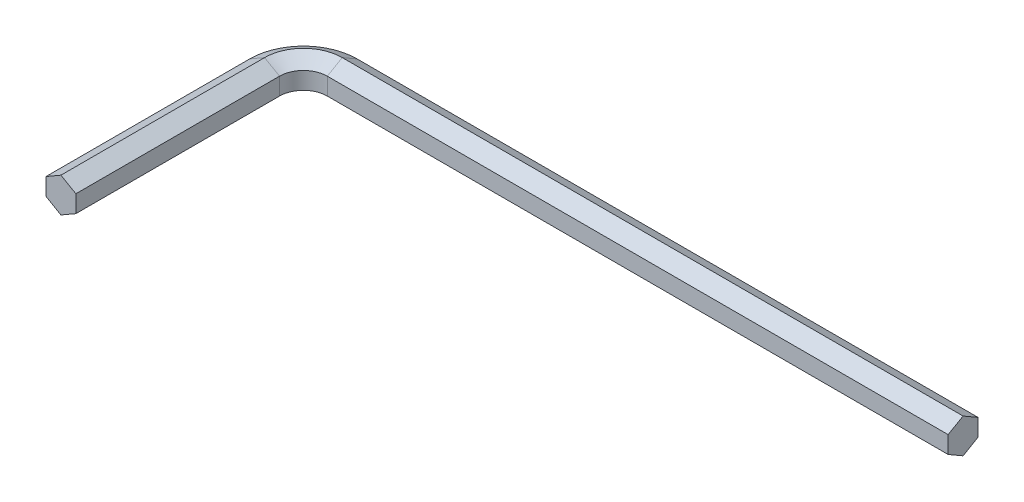
ISO-10303-21;
HEADER;
FILE_DESCRIPTION(('STEP AP214'),'2;1');
FILE_NAME('part.step','',(''),(''),'','','');
FILE_SCHEMA(('AUTOMOTIVE_DESIGN { 1 0 10303 214 1 1 1 1 }'));
ENDSEC;
DATA;
#1=APPLICATION_CONTEXT('core data for automotive mechanical design processes');
#2=APPLICATION_PROTOCOL_DEFINITION('international standard','automotive_design',2000,#1);
#3=PRODUCT_CONTEXT('',#1,'mechanical');
#4=PRODUCT('Part','Part','',(#3));
#5=PRODUCT_RELATED_PRODUCT_CATEGORY('part','',(#4));
#6=PRODUCT_DEFINITION_FORMATION('','',#4);
#7=PRODUCT_DEFINITION_CONTEXT('part definition',#1,'design');
#8=PRODUCT_DEFINITION('design','',#6,#7);
#9=PRODUCT_DEFINITION_SHAPE('','',#8);
#10=(LENGTH_UNIT() NAMED_UNIT(*) SI_UNIT(.MILLI.,.METRE.));
#11=(NAMED_UNIT(*) PLANE_ANGLE_UNIT() SI_UNIT($,.RADIAN.));
#12=(NAMED_UNIT(*) SI_UNIT($,.STERADIAN.) SOLID_ANGLE_UNIT());
#13=UNCERTAINTY_MEASURE_WITH_UNIT(LENGTH_MEASURE(1.E-05),#10,'distance_accuracy_value','');
#14=(GEOMETRIC_REPRESENTATION_CONTEXT(3) GLOBAL_UNCERTAINTY_ASSIGNED_CONTEXT((#13)) GLOBAL_UNIT_ASSIGNED_CONTEXT((#10,
#11,#12)) REPRESENTATION_CONTEXT('',''));
#15=CARTESIAN_POINT('',(0.,0.,0.));
#16=DIRECTION('',(0.,0.,1.));
#17=DIRECTION('',(1.,0.,0.));
#18=AXIS2_PLACEMENT_3D('',#15,#16,#17);
#19=CARTESIAN_POINT('',(-53.975,1.44337567297406,2.00000000000001));
#20=DIRECTION('',(-1.,0.,0.));
#21=DIRECTION('',(0.,-1.,0.));
#22=AXIS2_PLACEMENT_3D('',#19,#20,#21);
#23=PLANE('',#22);
#24=DIRECTION('',(0.,-1.,0.));
#25=VECTOR('',#24,1.);
#26=CARTESIAN_POINT('',(-53.975,1.44337567297406,2.00000000000001));
#27=LINE('',#26,#25);
#28=CARTESIAN_POINT('',(-53.975,1.44337567297406,2.00000000000001));
#29=VERTEX_POINT('',#28);
#30=CARTESIAN_POINT('',(-53.975,0.,2.00000000000001));
#31=VERTEX_POINT('',#30);
#32=EDGE_CURVE('E135',#29,#31,#27,.T.);
#33=ORIENTED_EDGE('',*,*,#32,.F.);
#34=DIRECTION('',(0.,0.,1.));
#35=VECTOR('',#34,1.);
#36=CARTESIAN_POINT('',(-53.975,1.44337567297406,2.00000000000001));
#37=LINE('',#36,#35);
#38=CARTESIAN_POINT('',(-53.975,1.44337567297406,19.05));
#39=VERTEX_POINT('',#38);
#40=EDGE_CURVE('E40',#29,#39,#37,.T.);
#41=ORIENTED_EDGE('',*,*,#40,.T.);
#42=DIRECTION('',(0.,-1.,0.));
#43=VECTOR('',#42,1.);
#44=CARTESIAN_POINT('',(-53.975,1.44337567297406,19.05));
#45=LINE('',#44,#43);
#46=CARTESIAN_POINT('',(-53.975,0.,19.05));
#47=VERTEX_POINT('',#46);
#48=EDGE_CURVE('E47',#39,#47,#45,.T.);
#49=ORIENTED_EDGE('',*,*,#48,.T.);
#50=DIRECTION('',(0.,0.,1.));
#51=VECTOR('',#50,1.);
#52=CARTESIAN_POINT('',(-53.975,0.,2.00000000000001));
#53=LINE('',#52,#51);
#54=EDGE_CURVE('E11',#31,#47,#53,.T.);
#55=ORIENTED_EDGE('',*,*,#54,.F.);
#56=EDGE_LOOP('',(#33,#41,#49,#55));
#57=FACE_BOUND('',#56,.T.);
#58=ADVANCED_FACE('F33',(#57),#23,.F.);
#59=CARTESIAN_POINT('',(-55.225,2.1650635094611,2.00000000000001));
#60=DIRECTION('',(-0.5,-0.866025403784439,0.));
#61=DIRECTION('',(0.866025403784439,-0.5,0.));
#62=AXIS2_PLACEMENT_3D('',#59,#60,#61);
#63=PLANE('',#62);
#64=DIRECTION('',(0.866025403784439,-0.5,0.));
#65=VECTOR('',#64,1.);
#66=CARTESIAN_POINT('',(-55.225,2.1650635094611,2.00000000000001));
#67=LINE('',#66,#65);
#68=CARTESIAN_POINT('',(-55.225,2.1650635094611,2.00000000000001));
#69=VERTEX_POINT('',#68);
#70=EDGE_CURVE('E203',#69,#29,#67,.T.);
#71=ORIENTED_EDGE('',*,*,#70,.F.);
#72=DIRECTION('',(0.,0.,1.));
#73=VECTOR('',#72,1.);
#74=CARTESIAN_POINT('',(-55.225,2.1650635094611,2.00000000000001));
#75=LINE('',#74,#73);
#76=CARTESIAN_POINT('',(-55.225,2.1650635094611,19.05));
#77=VERTEX_POINT('',#76);
#78=EDGE_CURVE('E239',#69,#77,#75,.T.);
#79=ORIENTED_EDGE('',*,*,#78,.T.);
#80=DIRECTION('',(0.866025403784439,-0.5,0.));
#81=VECTOR('',#80,1.);
#82=CARTESIAN_POINT('',(-55.225,2.1650635094611,19.05));
#83=LINE('',#82,#81);
#84=EDGE_CURVE('E55',#77,#39,#83,.T.);
#85=ORIENTED_EDGE('',*,*,#84,.T.);
#86=ORIENTED_EDGE('',*,*,#40,.F.);
#87=EDGE_LOOP('',(#71,#79,#85,#86));
#88=FACE_BOUND('',#87,.T.);
#89=ADVANCED_FACE('F242',(#88),#63,.F.);
#90=CARTESIAN_POINT('',(-56.475,1.44337567297406,2.00000000000001));
#91=DIRECTION('',(0.5,-0.866025403784439,0.));
#92=DIRECTION('',(0.866025403784439,0.5,0.));
#93=AXIS2_PLACEMENT_3D('',#90,#91,#92);
#94=PLANE('',#93);
#95=DIRECTION('',(0.866025403784439,0.5,0.));
#96=VECTOR('',#95,1.);
#97=CARTESIAN_POINT('',(-56.475,1.44337567297406,2.00000000000001));
#98=LINE('',#97,#96);
#99=CARTESIAN_POINT('',(-56.475,1.44337567297406,2.00000000000001));
#100=VERTEX_POINT('',#99);
#101=EDGE_CURVE('E200',#100,#69,#98,.T.);
#102=ORIENTED_EDGE('',*,*,#101,.F.);
#103=DIRECTION('',(0.,0.,1.));
#104=VECTOR('',#103,1.);
#105=CARTESIAN_POINT('',(-56.475,1.44337567297406,2.00000000000001));
#106=LINE('',#105,#104);
#107=CARTESIAN_POINT('',(-56.475,1.44337567297406,19.05));
#108=VERTEX_POINT('',#107);
#109=EDGE_CURVE('E236',#100,#108,#106,.T.);
#110=ORIENTED_EDGE('',*,*,#109,.T.);
#111=DIRECTION('',(0.866025403784439,0.5,0.));
#112=VECTOR('',#111,1.);
#113=CARTESIAN_POINT('',(-56.475,1.44337567297406,19.05));
#114=LINE('',#113,#112);
#115=EDGE_CURVE('E226',#108,#77,#114,.T.);
#116=ORIENTED_EDGE('',*,*,#115,.T.);
#117=ORIENTED_EDGE('',*,*,#78,.F.);
#118=EDGE_LOOP('',(#102,#110,#116,#117));
#119=FACE_BOUND('',#118,.T.);
#120=ADVANCED_FACE('F277',(#119),#94,.F.);
#121=CARTESIAN_POINT('',(-56.475,0.,2.00000000000001));
#122=DIRECTION('',(1.,0.,0.));
#123=DIRECTION('',(0.,1.,0.));
#124=AXIS2_PLACEMENT_3D('',#121,#122,#123);
#125=PLANE('',#124);
#126=DIRECTION('',(0.,1.,0.));
#127=VECTOR('',#126,1.);
#128=CARTESIAN_POINT('',(-56.475,0.,2.00000000000001));
#129=LINE('',#128,#127);
#130=CARTESIAN_POINT('',(-56.475,0.,2.00000000000001));
#131=VERTEX_POINT('',#130);
#132=EDGE_CURVE('E197',#131,#100,#129,.T.);
#133=ORIENTED_EDGE('',*,*,#132,.F.);
#134=DIRECTION('',(0.,0.,1.));
#135=VECTOR('',#134,1.);
#136=CARTESIAN_POINT('',(-56.475,0.,2.00000000000001));
#137=LINE('',#136,#135);
#138=CARTESIAN_POINT('',(-56.475,0.,19.05));
#139=VERTEX_POINT('',#138);
#140=EDGE_CURVE('E233',#131,#139,#137,.T.);
#141=ORIENTED_EDGE('',*,*,#140,.T.);
#142=DIRECTION('',(0.,1.,0.));
#143=VECTOR('',#142,1.);
#144=CARTESIAN_POINT('',(-56.475,0.,19.05));
#145=LINE('',#144,#143);
#146=EDGE_CURVE('E224',#139,#108,#145,.T.);
#147=ORIENTED_EDGE('',*,*,#146,.T.);
#148=ORIENTED_EDGE('',*,*,#109,.F.);
#149=EDGE_LOOP('',(#133,#141,#147,#148));
#150=FACE_BOUND('',#149,.T.);
#151=ADVANCED_FACE('F268',(#150),#125,.F.);
#152=CARTESIAN_POINT('',(-55.225,-0.721687836487032,2.00000000000001));
#153=DIRECTION('',(0.5,0.866025403784438,0.));
#154=DIRECTION('',(-0.866025403784438,0.5,0.));
#155=AXIS2_PLACEMENT_3D('',#152,#153,#154);
#156=PLANE('',#155);
#157=DIRECTION('',(-0.866025403784438,0.5,0.));
#158=VECTOR('',#157,1.);
#159=CARTESIAN_POINT('',(-55.225,-0.721687836487032,2.00000000000001));
#160=LINE('',#159,#158);
#161=CARTESIAN_POINT('',(-55.225,-0.721687836487032,2.00000000000001));
#162=VERTEX_POINT('',#161);
#163=EDGE_CURVE('E195',#162,#131,#160,.T.);
#164=ORIENTED_EDGE('',*,*,#163,.F.);
#165=DIRECTION('',(0.,0.,1.));
#166=VECTOR('',#165,1.);
#167=CARTESIAN_POINT('',(-55.225,-0.721687836487032,2.00000000000001));
#168=LINE('',#167,#166);
#169=CARTESIAN_POINT('',(-55.225,-0.721687836487032,19.05));
#170=VERTEX_POINT('',#169);
#171=EDGE_CURVE('E230',#162,#170,#168,.T.);
#172=ORIENTED_EDGE('',*,*,#171,.T.);
#173=DIRECTION('',(-0.866025403784438,0.5,0.));
#174=VECTOR('',#173,1.);
#175=CARTESIAN_POINT('',(-55.225,-0.721687836487032,19.05));
#176=LINE('',#175,#174);
#177=EDGE_CURVE('E222',#170,#139,#176,.T.);
#178=ORIENTED_EDGE('',*,*,#177,.T.);
#179=ORIENTED_EDGE('',*,*,#140,.F.);
#180=EDGE_LOOP('',(#164,#172,#178,#179));
#181=FACE_BOUND('',#180,.T.);
#182=ADVANCED_FACE('F271',(#181),#156,.F.);
#183=CARTESIAN_POINT('',(-53.975,0.,2.00000000000001));
#184=DIRECTION('',(-0.5,0.866025403784439,0.));
#185=DIRECTION('',(-0.866025403784439,-0.5,0.));
#186=AXIS2_PLACEMENT_3D('',#183,#184,#185);
#187=PLANE('',#186);
#188=DIRECTION('',(-0.866025403784439,-0.5,0.));
#189=VECTOR('',#188,1.);
#190=CARTESIAN_POINT('',(-53.975,0.,2.00000000000001));
#191=LINE('',#190,#189);
#192=EDGE_CURVE('E131',#31,#162,#191,.T.);
#193=ORIENTED_EDGE('',*,*,#192,.F.);
#194=ORIENTED_EDGE('',*,*,#54,.T.);
#195=DIRECTION('',(-0.866025403784439,-0.5,0.));
#196=VECTOR('',#195,1.);
#197=CARTESIAN_POINT('',(-53.975,0.,19.05));
#198=LINE('',#197,#196);
#199=EDGE_CURVE('E220',#47,#170,#198,.T.);
#200=ORIENTED_EDGE('',*,*,#199,.T.);
#201=ORIENTED_EDGE('',*,*,#171,.F.);
#202=EDGE_LOOP('',(#193,#194,#200,#201));
#203=FACE_BOUND('',#202,.T.);
#204=ADVANCED_FACE('F311',(#203),#187,.F.);
#205=CARTESIAN_POINT('',(-51.975,0.,2.00000000000001));
#206=DIRECTION('',(0.,1.,0.));
#207=DIRECTION('',(0.,0.,1.));
#208=AXIS2_PLACEMENT_3D('',#205,#206,#207);
#209=CYLINDRICAL_SURFACE('',#208,2.);
#210=DIRECTION('',(0.,-1.,0.));
#211=VECTOR('',#210,1.);
#212=CARTESIAN_POINT('',(-51.975,1.44337567297406,0.));
#213=LINE('',#212,#211);
#214=CARTESIAN_POINT('',(-51.975,1.44337567297406,0.));
#215=VERTEX_POINT('',#214);
#216=CARTESIAN_POINT('',(-51.975,0.,0.));
#217=VERTEX_POINT('',#216);
#218=EDGE_CURVE('E155',#215,#217,#213,.T.);
#219=ORIENTED_EDGE('',*,*,#218,.F.);
#220=CARTESIAN_POINT('',(-51.975,1.44337567297406,2.00000000000001));
#221=DIRECTION('',(0.,1.,0.));
#222=DIRECTION('',(0.,0.,1.));
#223=AXIS2_PLACEMENT_3D('',#220,#221,#222);
#224=CIRCLE('',#223,2.);
#225=EDGE_CURVE('E215',#215,#29,#224,.T.);
#226=ORIENTED_EDGE('',*,*,#225,.T.);
#227=ORIENTED_EDGE('',*,*,#32,.T.);
#228=CARTESIAN_POINT('',(-51.975,0.,2.00000000000001));
#229=DIRECTION('',(0.,1.,0.));
#230=DIRECTION('',(0.,0.,1.));
#231=AXIS2_PLACEMENT_3D('',#228,#229,#230);
#232=CIRCLE('',#231,2.);
#233=EDGE_CURVE('E218',#217,#31,#232,.T.);
#234=ORIENTED_EDGE('',*,*,#233,.F.);
#235=EDGE_LOOP('',(#219,#226,#227,#234));
#236=FACE_BOUND('',#235,.T.);
#237=ADVANCED_FACE('F320',(#236),#209,.F.);
#238=CARTESIAN_POINT('',(-51.975,2.1650635094611,2.00000000000001));
#239=DIRECTION('',(0.,1.,0.));
#240=DIRECTION('',(0.,0.,1.));
#241=AXIS2_PLACEMENT_3D('',#238,#239,#240);
#242=CONICAL_SURFACE('',#241,3.25,1.0471975511966);
#243=DIRECTION('',(0.,-0.5,0.866025403784439));
#244=VECTOR('',#243,1.);
#245=CARTESIAN_POINT('',(-51.975,2.1650635094611,-1.24999999999999));
#246=LINE('',#245,#244);
#247=CARTESIAN_POINT('',(-51.975,2.1650635094611,-1.24999999999999));
#248=VERTEX_POINT('',#247);
#249=EDGE_CURVE('E171',#248,#215,#246,.T.);
#250=ORIENTED_EDGE('',*,*,#249,.F.);
#251=CARTESIAN_POINT('',(-51.975,2.1650635094611,2.00000000000001));
#252=DIRECTION('',(0.,1.,0.));
#253=DIRECTION('',(0.,0.,1.));
#254=AXIS2_PLACEMENT_3D('',#251,#252,#253);
#255=CIRCLE('',#254,3.25);
#256=EDGE_CURVE('E212',#248,#69,#255,.T.);
#257=ORIENTED_EDGE('',*,*,#256,.T.);
#258=ORIENTED_EDGE('',*,*,#70,.T.);
#259=ORIENTED_EDGE('',*,*,#225,.F.);
#260=EDGE_LOOP('',(#250,#257,#258,#259));
#261=FACE_BOUND('',#260,.T.);
#262=ADVANCED_FACE('F250',(#261),#242,.F.);
#263=CARTESIAN_POINT('',(-51.975,1.44337567297406,2.00000000000001));
#264=DIRECTION('',(0.,-1.,0.));
#265=DIRECTION('',(0.,0.,-1.));
#266=AXIS2_PLACEMENT_3D('',#263,#264,#265);
#267=CONICAL_SURFACE('',#266,4.5,1.0471975511966);
#268=DIRECTION('',(0.,0.5,0.866025403784439));
#269=VECTOR('',#268,1.);
#270=CARTESIAN_POINT('',(-51.975,1.44337567297406,-2.49999999999999));
#271=LINE('',#270,#269);
#272=CARTESIAN_POINT('',(-51.975,1.44337567297406,-2.49999999999999));
#273=VERTEX_POINT('',#272);
#274=EDGE_CURVE('E168',#273,#248,#271,.T.);
#275=ORIENTED_EDGE('',*,*,#274,.F.);
#276=CARTESIAN_POINT('',(-51.975,1.44337567297406,2.00000000000001));
#277=DIRECTION('',(0.,1.,0.));
#278=DIRECTION('',(0.,0.,1.));
#279=AXIS2_PLACEMENT_3D('',#276,#277,#278);
#280=CIRCLE('',#279,4.5);
#281=EDGE_CURVE('E209',#273,#100,#280,.T.);
#282=ORIENTED_EDGE('',*,*,#281,.T.);
#283=ORIENTED_EDGE('',*,*,#101,.T.);
#284=ORIENTED_EDGE('',*,*,#256,.F.);
#285=EDGE_LOOP('',(#275,#282,#283,#284));
#286=FACE_BOUND('',#285,.T.);
#287=ADVANCED_FACE('F247',(#286),#267,.T.);
#288=CARTESIAN_POINT('',(-51.975,0.,2.00000000000001));
#289=DIRECTION('',(0.,1.,0.));
#290=DIRECTION('',(0.,0.,1.));
#291=AXIS2_PLACEMENT_3D('',#288,#289,#290);
#292=CYLINDRICAL_SURFACE('',#291,4.5);
#293=DIRECTION('',(0.,1.,0.));
#294=VECTOR('',#293,1.);
#295=CARTESIAN_POINT('',(-51.975,0.,-2.49999999999999));
#296=LINE('',#295,#294);
#297=CARTESIAN_POINT('',(-51.975,0.,-2.49999999999999));
#298=VERTEX_POINT('',#297);
#299=EDGE_CURVE('E144',#298,#273,#296,.T.);
#300=ORIENTED_EDGE('',*,*,#299,.F.);
#301=CARTESIAN_POINT('',(-51.975,0.,2.00000000000001));
#302=DIRECTION('',(0.,1.,0.));
#303=DIRECTION('',(0.,0.,1.));
#304=AXIS2_PLACEMENT_3D('',#301,#302,#303);
#305=CIRCLE('',#304,4.5);
#306=EDGE_CURVE('E134',#298,#131,#305,.T.);
#307=ORIENTED_EDGE('',*,*,#306,.T.);
#308=ORIENTED_EDGE('',*,*,#132,.T.);
#309=ORIENTED_EDGE('',*,*,#281,.F.);
#310=EDGE_LOOP('',(#300,#307,#308,#309));
#311=FACE_BOUND('',#310,.T.);
#312=ADVANCED_FACE('F265',(#311),#292,.T.);
#313=CARTESIAN_POINT('',(-51.975,-0.721687836487032,2.00000000000001));
#314=DIRECTION('',(0.,1.,0.));
#315=DIRECTION('',(0.,0.,1.));
#316=AXIS2_PLACEMENT_3D('',#313,#314,#315);
#317=CONICAL_SURFACE('',#316,3.25,1.0471975511966);
#318=DIRECTION('',(0.,0.5,-0.866025403784438));
#319=VECTOR('',#318,1.);
#320=CARTESIAN_POINT('',(-51.975,-0.721687836487032,-1.24999999999999));
#321=LINE('',#320,#319);
#322=CARTESIAN_POINT('',(-51.975,-0.721687836487032,-1.24999999999999));
#323=VERTEX_POINT('',#322);
#324=EDGE_CURVE('E138',#323,#298,#321,.T.);
#325=ORIENTED_EDGE('',*,*,#324,.F.);
#326=CARTESIAN_POINT('',(-51.975,-0.721687836487032,2.00000000000001));
#327=DIRECTION('',(0.,1.,0.));
#328=DIRECTION('',(0.,0.,1.));
#329=AXIS2_PLACEMENT_3D('',#326,#327,#328);
#330=CIRCLE('',#329,3.25);
#331=EDGE_CURVE('E123',#323,#162,#330,.T.);
#332=ORIENTED_EDGE('',*,*,#331,.T.);
#333=ORIENTED_EDGE('',*,*,#163,.T.);
#334=ORIENTED_EDGE('',*,*,#306,.F.);
#335=EDGE_LOOP('',(#325,#332,#333,#334));
#336=FACE_BOUND('',#335,.T.);
#337=ADVANCED_FACE('F140',(#336),#317,.T.);
#338=CARTESIAN_POINT('',(-51.975,0.,2.00000000000001));
#339=DIRECTION('',(0.,-1.,0.));
#340=DIRECTION('',(0.,0.,-1.));
#341=AXIS2_PLACEMENT_3D('',#338,#339,#340);
#342=CONICAL_SURFACE('',#341,2.,1.0471975511966);
#343=DIRECTION('',(0.,-0.5,-0.866025403784439));
#344=VECTOR('',#343,1.);
#345=CARTESIAN_POINT('',(-51.975,0.,0.));
#346=LINE('',#345,#344);
#347=EDGE_CURVE('E128',#217,#323,#346,.T.);
#348=ORIENTED_EDGE('',*,*,#347,.F.);
#349=ORIENTED_EDGE('',*,*,#233,.T.);
#350=ORIENTED_EDGE('',*,*,#192,.T.);
#351=ORIENTED_EDGE('',*,*,#331,.F.);
#352=EDGE_LOOP('',(#348,#349,#350,#351));
#353=FACE_BOUND('',#352,.T.);
#354=ADVANCED_FACE('F125',(#353),#342,.F.);
#355=CARTESIAN_POINT('',(-51.975,0.,0.));
#356=DIRECTION('',(0.,-0.866025403784439,0.5));
#357=DIRECTION('',(0.,-0.5,-0.866025403784439));
#358=AXIS2_PLACEMENT_3D('',#355,#356,#357);
#359=PLANE('',#358);
#360=DIRECTION('',(0.,-0.5,-0.866025403784439));
#361=VECTOR('',#360,1.);
#362=CARTESIAN_POINT('',(0.,0.,0.));
#363=LINE('',#362,#361);
#364=CARTESIAN_POINT('',(0.,0.,0.));
#365=VERTEX_POINT('',#364);
#366=CARTESIAN_POINT('',(0.,-0.721687836487032,-1.25));
#367=VERTEX_POINT('',#366);
#368=EDGE_CURVE('E175',#365,#367,#363,.T.);
#369=ORIENTED_EDGE('',*,*,#368,.F.);
#370=DIRECTION('',(1.,0.,0.));
#371=VECTOR('',#370,1.);
#372=CARTESIAN_POINT('',(-51.975,0.,0.));
#373=LINE('',#372,#371);
#374=EDGE_CURVE('E158',#217,#365,#373,.T.);
#375=ORIENTED_EDGE('',*,*,#374,.F.);
#376=ORIENTED_EDGE('',*,*,#347,.T.);
#377=DIRECTION('',(1.,0.,0.));
#378=VECTOR('',#377,1.);
#379=CARTESIAN_POINT('',(-51.975,-0.721687836487032,-1.24999999999999));
#380=LINE('',#379,#378);
#381=EDGE_CURVE('E147',#323,#367,#380,.T.);
#382=ORIENTED_EDGE('',*,*,#381,.T.);
#383=EDGE_LOOP('',(#369,#375,#376,#382));
#384=FACE_BOUND('',#383,.T.);
#385=ADVANCED_FACE('F157',(#384),#359,.T.);
#386=CARTESIAN_POINT('',(-51.975,1.44337567297406,0.));
#387=DIRECTION('',(0.,0.,1.));
#388=DIRECTION('',(1.,0.,0.));
#389=AXIS2_PLACEMENT_3D('',#386,#387,#388);
#390=PLANE('',#389);
#391=DIRECTION('',(0.,-1.,0.));
#392=VECTOR('',#391,1.);
#393=CARTESIAN_POINT('',(0.,1.44337567297406,0.));
#394=LINE('',#393,#392);
#395=CARTESIAN_POINT('',(0.,1.44337567297406,0.));
#396=VERTEX_POINT('',#395);
#397=EDGE_CURVE('E160',#396,#365,#394,.T.);
#398=ORIENTED_EDGE('',*,*,#397,.F.);
#399=DIRECTION('',(1.,0.,0.));
#400=VECTOR('',#399,1.);
#401=CARTESIAN_POINT('',(-51.975,1.44337567297406,0.));
#402=LINE('',#401,#400);
#403=EDGE_CURVE('E187',#215,#396,#402,.T.);
#404=ORIENTED_EDGE('',*,*,#403,.F.);
#405=ORIENTED_EDGE('',*,*,#218,.T.);
#406=ORIENTED_EDGE('',*,*,#374,.T.);
#407=EDGE_LOOP('',(#398,#404,#405,#406));
#408=FACE_BOUND('',#407,.T.);
#409=ADVANCED_FACE('F379',(#408),#390,.T.);
#410=CARTESIAN_POINT('',(-51.975,2.1650635094611,-1.24999999999999));
#411=DIRECTION('',(0.,0.866025403784439,0.5));
#412=DIRECTION('',(0.,-0.5,0.866025403784439));
#413=AXIS2_PLACEMENT_3D('',#410,#411,#412);
#414=PLANE('',#413);
#415=DIRECTION('',(0.,-0.5,0.866025403784439));
#416=VECTOR('',#415,1.);
#417=CARTESIAN_POINT('',(0.,2.1650635094611,-1.25));
#418=LINE('',#417,#416);
#419=CARTESIAN_POINT('',(0.,2.1650635094611,-1.25));
#420=VERTEX_POINT('',#419);
#421=EDGE_CURVE('E163',#420,#396,#418,.T.);
#422=ORIENTED_EDGE('',*,*,#421,.F.);
#423=DIRECTION('',(1.,0.,0.));
#424=VECTOR('',#423,1.);
#425=CARTESIAN_POINT('',(-51.975,2.1650635094611,-1.24999999999999));
#426=LINE('',#425,#424);
#427=EDGE_CURVE('E189',#248,#420,#426,.T.);
#428=ORIENTED_EDGE('',*,*,#427,.F.);
#429=ORIENTED_EDGE('',*,*,#249,.T.);
#430=ORIENTED_EDGE('',*,*,#403,.T.);
#431=EDGE_LOOP('',(#422,#428,#429,#430));
#432=FACE_BOUND('',#431,.T.);
#433=ADVANCED_FACE('F255',(#432),#414,.T.);
#434=CARTESIAN_POINT('',(-51.975,1.44337567297406,-2.49999999999999));
#435=DIRECTION('',(0.,0.866025403784439,-0.5));
#436=DIRECTION('',(0.,0.5,0.866025403784439));
#437=AXIS2_PLACEMENT_3D('',#434,#435,#436);
#438=PLANE('',#437);
#439=DIRECTION('',(0.,0.5,0.866025403784439));
#440=VECTOR('',#439,1.);
#441=CARTESIAN_POINT('',(0.,1.44337567297406,-2.5));
#442=LINE('',#441,#440);
#443=CARTESIAN_POINT('',(0.,1.44337567297406,-2.5));
#444=VERTEX_POINT('',#443);
#445=EDGE_CURVE('E181',#444,#420,#442,.T.);
#446=ORIENTED_EDGE('',*,*,#445,.F.);
#447=DIRECTION('',(1.,0.,0.));
#448=VECTOR('',#447,1.);
#449=CARTESIAN_POINT('',(-51.975,1.44337567297406,-2.49999999999999));
#450=LINE('',#449,#448);
#451=EDGE_CURVE('E191',#273,#444,#450,.T.);
#452=ORIENTED_EDGE('',*,*,#451,.F.);
#453=ORIENTED_EDGE('',*,*,#274,.T.);
#454=ORIENTED_EDGE('',*,*,#427,.T.);
#455=EDGE_LOOP('',(#446,#452,#453,#454));
#456=FACE_BOUND('',#455,.T.);
#457=ADVANCED_FACE('F259',(#456),#438,.T.);
#458=CARTESIAN_POINT('',(-51.975,0.,-2.49999999999999));
#459=DIRECTION('',(0.,0.,-1.));
#460=DIRECTION('',(0.,1.,0.));
#461=AXIS2_PLACEMENT_3D('',#458,#459,#460);
#462=PLANE('',#461);
#463=DIRECTION('',(0.,1.,0.));
#464=VECTOR('',#463,1.);
#465=CARTESIAN_POINT('',(0.,0.,-2.5));
#466=LINE('',#465,#464);
#467=CARTESIAN_POINT('',(0.,0.,-2.5));
#468=VERTEX_POINT('',#467);
#469=EDGE_CURVE('E178',#468,#444,#466,.T.);
#470=ORIENTED_EDGE('',*,*,#469,.F.);
#471=DIRECTION('',(1.,0.,0.));
#472=VECTOR('',#471,1.);
#473=CARTESIAN_POINT('',(-51.975,0.,-2.49999999999999));
#474=LINE('',#473,#472);
#475=EDGE_CURVE('E154',#298,#468,#474,.T.);
#476=ORIENTED_EDGE('',*,*,#475,.F.);
#477=ORIENTED_EDGE('',*,*,#299,.T.);
#478=ORIENTED_EDGE('',*,*,#451,.T.);
#479=EDGE_LOOP('',(#470,#476,#477,#478));
#480=FACE_BOUND('',#479,.T.);
#481=ADVANCED_FACE('F263',(#480),#462,.T.);
#482=CARTESIAN_POINT('',(-51.975,-0.721687836487032,-1.24999999999999));
#483=DIRECTION('',(0.,-0.866025403784438,-0.5));
#484=DIRECTION('',(0.,0.5,-0.866025403784438));
#485=AXIS2_PLACEMENT_3D('',#482,#483,#484);
#486=PLANE('',#485);
#487=DIRECTION('',(0.,0.5,-0.866025403784438));
#488=VECTOR('',#487,1.);
#489=CARTESIAN_POINT('',(0.,-0.721687836487032,-1.25));
#490=LINE('',#489,#488);
#491=EDGE_CURVE('E150',#367,#468,#490,.T.);
#492=ORIENTED_EDGE('',*,*,#491,.F.);
#493=ORIENTED_EDGE('',*,*,#381,.F.);
#494=ORIENTED_EDGE('',*,*,#324,.T.);
#495=ORIENTED_EDGE('',*,*,#475,.T.);
#496=EDGE_LOOP('',(#492,#493,#494,#495));
#497=FACE_BOUND('',#496,.T.);
#498=ADVANCED_FACE('F148',(#497),#486,.T.);
#499=CARTESIAN_POINT('',(-53.975,0.,19.05));
#500=DIRECTION('',(0.,0.,-1.));
#501=DIRECTION('',(-1.,0.,0.));
#502=AXIS2_PLACEMENT_3D('',#499,#500,#501);
#503=PLANE('',#502);
#504=ORIENTED_EDGE('',*,*,#199,.F.);
#505=ORIENTED_EDGE('',*,*,#48,.F.);
#506=ORIENTED_EDGE('',*,*,#84,.F.);
#507=ORIENTED_EDGE('',*,*,#115,.F.);
#508=ORIENTED_EDGE('',*,*,#146,.F.);
#509=ORIENTED_EDGE('',*,*,#177,.F.);
#510=EDGE_LOOP('',(#504,#505,#506,#507,#508,#509));
#511=FACE_BOUND('',#510,.T.);
#512=ADVANCED_FACE('F276',(#511),#503,.F.);
#513=CARTESIAN_POINT('',(0.,0.,0.));
#514=DIRECTION('',(1.,0.,0.));
#515=DIRECTION('',(0.,0.,-1.));
#516=AXIS2_PLACEMENT_3D('',#513,#514,#515);
#517=PLANE('',#516);
#518=ORIENTED_EDGE('',*,*,#368,.T.);
#519=ORIENTED_EDGE('',*,*,#491,.T.);
#520=ORIENTED_EDGE('',*,*,#469,.T.);
#521=ORIENTED_EDGE('',*,*,#445,.T.);
#522=ORIENTED_EDGE('',*,*,#421,.T.);
#523=ORIENTED_EDGE('',*,*,#397,.T.);
#524=EDGE_LOOP('',(#518,#519,#520,#521,#522,#523));
#525=FACE_BOUND('',#524,.T.);
#526=ADVANCED_FACE('F429',(#525),#517,.T.);
#527=CLOSED_SHELL('',(#58,#89,#120,#151,#182,#204,#237,#262,#287,#312,#337,#354,#385,#409,#433,
#457,#481,#498,#512,#526));
#528=MANIFOLD_SOLID_BREP('B2',#527);
#529=ADVANCED_BREP_SHAPE_REPRESENTATION('',(#18,#528),#14);
#530=SHAPE_DEFINITION_REPRESENTATION(#9,#529);
ENDSEC;
END-ISO-10303-21;
